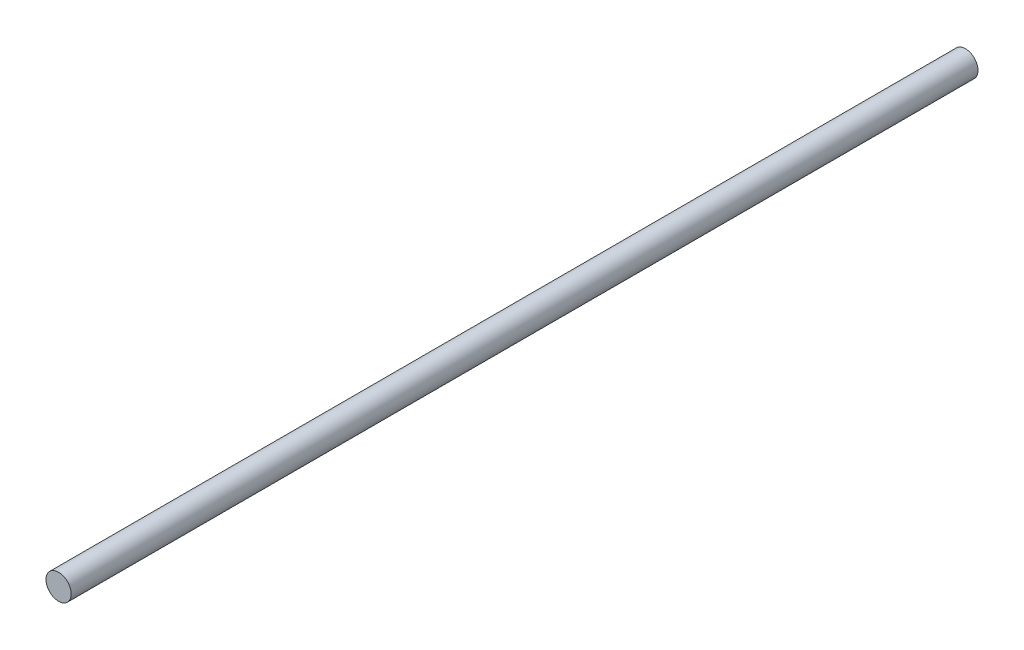
ISO-10303-21;
HEADER;
FILE_DESCRIPTION(('STEP AP214'),'2;1');
FILE_NAME('part.step','',(''),(''),'','','');
FILE_SCHEMA(('AUTOMOTIVE_DESIGN { 1 0 10303 214 1 1 1 1 }'));
ENDSEC;
DATA;
#1=APPLICATION_CONTEXT('core data for automotive mechanical design processes');
#2=APPLICATION_PROTOCOL_DEFINITION('international standard','automotive_design',2000,#1);
#3=PRODUCT_CONTEXT('',#1,'mechanical');
#4=PRODUCT('Part','Part','',(#3));
#5=PRODUCT_RELATED_PRODUCT_CATEGORY('part','',(#4));
#6=PRODUCT_DEFINITION_FORMATION('','',#4);
#7=PRODUCT_DEFINITION_CONTEXT('part definition',#1,'design');
#8=PRODUCT_DEFINITION('design','',#6,#7);
#9=PRODUCT_DEFINITION_SHAPE('','',#8);
#10=(LENGTH_UNIT() NAMED_UNIT(*) SI_UNIT(.MILLI.,.METRE.));
#11=(NAMED_UNIT(*) PLANE_ANGLE_UNIT() SI_UNIT($,.RADIAN.));
#12=(NAMED_UNIT(*) SI_UNIT($,.STERADIAN.) SOLID_ANGLE_UNIT());
#13=UNCERTAINTY_MEASURE_WITH_UNIT(LENGTH_MEASURE(1.E-05),#10,'distance_accuracy_value','');
#14=(GEOMETRIC_REPRESENTATION_CONTEXT(3) GLOBAL_UNCERTAINTY_ASSIGNED_CONTEXT((#13)) GLOBAL_UNIT_ASSIGNED_CONTEXT((#10,
#11,#12)) REPRESENTATION_CONTEXT('',''));
#15=CARTESIAN_POINT('',(0.,0.,0.));
#16=DIRECTION('',(0.,0.,1.));
#17=DIRECTION('',(1.,0.,0.));
#18=AXIS2_PLACEMENT_3D('',#15,#16,#17);
#19=CARTESIAN_POINT('',(0.,0.,228.6));
#20=DIRECTION('',(0.,0.,-1.));
#21=DIRECTION('',(-1.,0.,0.));
#22=AXIS2_PLACEMENT_3D('',#19,#20,#21);
#23=CYLINDRICAL_SURFACE('',#22,3.175);
#24=CARTESIAN_POINT('',(0.,0.,228.6));
#25=DIRECTION('',(0.,0.,1.));
#26=DIRECTION('',(1.,0.,0.));
#27=AXIS2_PLACEMENT_3D('',#24,#25,#26);
#28=CIRCLE('',#27,3.175);
#29=CARTESIAN_POINT('',(3.175,0.,228.6));
#30=VERTEX_POINT('',#29);
#31=EDGE_CURVE('E10',#30,#30,#28,.T.);
#32=ORIENTED_EDGE('',*,*,#31,.F.);
#33=EDGE_LOOP('',(#32));
#34=FACE_BOUND('',#33,.T.);
#35=CARTESIAN_POINT('',(0.,0.,0.));
#36=DIRECTION('',(0.,0.,1.));
#37=DIRECTION('',(1.,0.,0.));
#38=AXIS2_PLACEMENT_3D('',#35,#36,#37);
#39=CIRCLE('',#38,3.175);
#40=CARTESIAN_POINT('',(3.175,0.,0.));
#41=VERTEX_POINT('',#40);
#42=EDGE_CURVE('E42',#41,#41,#39,.T.);
#43=ORIENTED_EDGE('',*,*,#42,.T.);
#44=EDGE_LOOP('',(#43));
#45=FACE_BOUND('',#44,.T.);
#46=ADVANCED_FACE('F39',(#34,#45),#23,.T.);
#47=CARTESIAN_POINT('',(0.,0.,228.6));
#48=DIRECTION('',(0.,0.,1.));
#49=DIRECTION('',(1.,0.,0.));
#50=AXIS2_PLACEMENT_3D('',#47,#48,#49);
#51=PLANE('',#50);
#52=ORIENTED_EDGE('',*,*,#31,.T.);
#53=EDGE_LOOP('',(#52));
#54=FACE_BOUND('',#53,.T.);
#55=ADVANCED_FACE('F54',(#54),#51,.T.);
#56=CARTESIAN_POINT('',(0.,0.,0.));
#57=DIRECTION('',(0.,0.,1.));
#58=DIRECTION('',(1.,0.,0.));
#59=AXIS2_PLACEMENT_3D('',#56,#57,#58);
#60=PLANE('',#59);
#61=ORIENTED_EDGE('',*,*,#42,.F.);
#62=EDGE_LOOP('',(#61));
#63=FACE_BOUND('',#62,.T.);
#64=ADVANCED_FACE('F52',(#63),#60,.F.);
#65=CLOSED_SHELL('',(#46,#55,#64));
#66=MANIFOLD_SOLID_BREP('B2',#65);
#67=ADVANCED_BREP_SHAPE_REPRESENTATION('',(#18,#66),#14);
#68=SHAPE_DEFINITION_REPRESENTATION(#9,#67);
ENDSEC;
END-ISO-10303-21;
